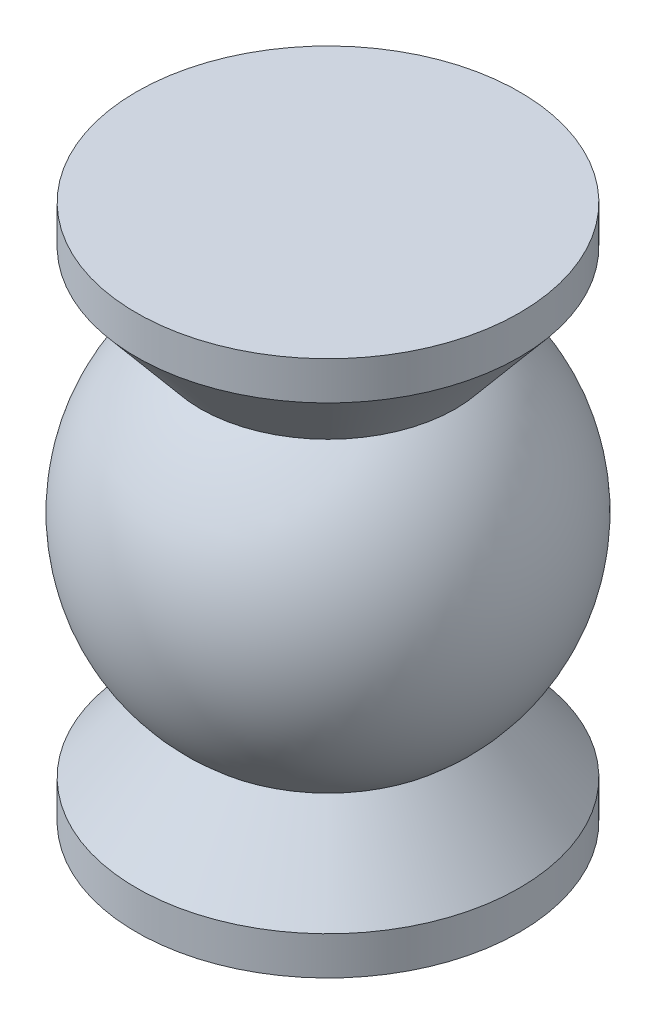
ISO-10303-21;
HEADER;
FILE_DESCRIPTION(('STEP AP214'),'2;1');
FILE_NAME('part.step','',(''),(''),'','','');
FILE_SCHEMA(('AUTOMOTIVE_DESIGN { 1 0 10303 214 1 1 1 1 }'));
ENDSEC;
DATA;
#1=APPLICATION_CONTEXT('core data for automotive mechanical design processes');
#2=APPLICATION_PROTOCOL_DEFINITION('international standard','automotive_design',2000,#1);
#3=PRODUCT_CONTEXT('',#1,'mechanical');
#4=PRODUCT('Part','Part','',(#3));
#5=PRODUCT_RELATED_PRODUCT_CATEGORY('part','',(#4));
#6=PRODUCT_DEFINITION_FORMATION('','',#4);
#7=PRODUCT_DEFINITION_CONTEXT('part definition',#1,'design');
#8=PRODUCT_DEFINITION('design','',#6,#7);
#9=PRODUCT_DEFINITION_SHAPE('','',#8);
#10=(LENGTH_UNIT() NAMED_UNIT(*) SI_UNIT(.MILLI.,.METRE.));
#11=(NAMED_UNIT(*) PLANE_ANGLE_UNIT() SI_UNIT($,.RADIAN.));
#12=(NAMED_UNIT(*) SI_UNIT($,.STERADIAN.) SOLID_ANGLE_UNIT());
#13=UNCERTAINTY_MEASURE_WITH_UNIT(LENGTH_MEASURE(1.E-05),#10,'distance_accuracy_value','');
#14=(GEOMETRIC_REPRESENTATION_CONTEXT(3) GLOBAL_UNCERTAINTY_ASSIGNED_CONTEXT((#13)) GLOBAL_UNIT_ASSIGNED_CONTEXT((#10,
#11,#12)) REPRESENTATION_CONTEXT('',''));
#15=CARTESIAN_POINT('',(0.,0.,0.));
#16=DIRECTION('',(0.,0.,1.));
#17=DIRECTION('',(1.,0.,0.));
#18=AXIS2_PLACEMENT_3D('',#15,#16,#17);
#19=CARTESIAN_POINT('',(0.,0.,0.));
#20=DIRECTION('',(0.,1.,0.));
#21=DIRECTION('',(-1.,0.,0.));
#22=AXIS2_PLACEMENT_3D('',#19,#20,#21);
#23=PLANE('',#22);
#24=CARTESIAN_POINT('',(0.,0.,0.));
#25=DIRECTION('',(0.,1.,0.));
#26=DIRECTION('',(-1.,0.,0.));
#27=AXIS2_PLACEMENT_3D('',#24,#25,#26);
#28=CIRCLE('',#27,25.);
#29=CARTESIAN_POINT('',(-25.,0.,0.));
#30=VERTEX_POINT('',#29);
#31=EDGE_CURVE('E10',#30,#30,#28,.T.);
#32=ORIENTED_EDGE('',*,*,#31,.T.);
#33=EDGE_LOOP('',(#32));
#34=FACE_BOUND('',#33,.T.);
#35=ADVANCED_FACE('F37',(#34),#23,.T.);
#36=CARTESIAN_POINT('',(0.,0.,0.));
#37=DIRECTION('',(0.,1.,0.));
#38=DIRECTION('',(-1.,0.,0.));
#39=AXIS2_PLACEMENT_3D('',#36,#37,#38);
#40=CYLINDRICAL_SURFACE('',#39,25.);
#41=CARTESIAN_POINT('',(0.,-5.,0.));
#42=DIRECTION('',(0.,1.,0.));
#43=DIRECTION('',(-1.,0.,0.));
#44=AXIS2_PLACEMENT_3D('',#41,#42,#43);
#45=CIRCLE('',#44,25.);
#46=CARTESIAN_POINT('',(-25.,-5.,0.));
#47=VERTEX_POINT('',#46);
#48=EDGE_CURVE('E43',#47,#47,#45,.T.);
#49=ORIENTED_EDGE('',*,*,#48,.T.);
#50=EDGE_LOOP('',(#49));
#51=FACE_BOUND('',#50,.T.);
#52=ORIENTED_EDGE('',*,*,#31,.F.);
#53=EDGE_LOOP('',(#52));
#54=FACE_BOUND('',#53,.T.);
#55=ADVANCED_FACE('F75',(#51,#54),#40,.T.);
#56=CARTESIAN_POINT('',(0.,-5.,0.));
#57=DIRECTION('',(0.,1.,0.));
#58=DIRECTION('',(-1.,0.,0.));
#59=AXIS2_PLACEMENT_3D('',#56,#57,#58);
#60=CONICAL_SURFACE('',#59,25.,0.694738276196703);
#61=CARTESIAN_POINT('',(0.,-15.,0.));
#62=DIRECTION('',(0.,1.,0.));
#63=DIRECTION('',(-1.,0.,0.));
#64=AXIS2_PLACEMENT_3D('',#61,#62,#63);
#65=CIRCLE('',#64,16.6666666666667);
#66=CARTESIAN_POINT('',(-16.6666666666667,-15.,0.));
#67=VERTEX_POINT('',#66);
#68=EDGE_CURVE('E47',#67,#67,#65,.T.);
#69=ORIENTED_EDGE('',*,*,#68,.T.);
#70=EDGE_LOOP('',(#69));
#71=FACE_BOUND('',#70,.T.);
#72=ORIENTED_EDGE('',*,*,#48,.F.);
#73=EDGE_LOOP('',(#72));
#74=FACE_BOUND('',#73,.T.);
#75=ADVANCED_FACE('F79',(#71,#74),#60,.T.);
#76=CARTESIAN_POINT('',(0.,-35.,0.));
#77=DIRECTION('',(0.,1.,0.));
#78=DIRECTION('',(-1.,0.,0.));
#79=AXIS2_PLACEMENT_3D('',#76,#77,#78);
#80=SPHERICAL_SURFACE('',#79,26.0341655863555);
#81=CARTESIAN_POINT('',(0.,-55.,0.));
#82=DIRECTION('',(0.,1.,0.));
#83=DIRECTION('',(-1.,0.,0.));
#84=AXIS2_PLACEMENT_3D('',#81,#82,#83);
#85=CIRCLE('',#84,16.6666666666667);
#86=CARTESIAN_POINT('',(-16.6666666666667,-55.,0.));
#87=VERTEX_POINT('',#86);
#88=EDGE_CURVE('E51',#87,#87,#85,.T.);
#89=CARTESIAN_POINT('',(-16.6666666666667,-55.,0.));
#90=CARTESIAN_POINT('',(-17.0317003772507,-54.6958234441406,0.));
#91=CARTESIAN_POINT('',(-17.3883878154096,-54.3816334350001,0.));
#92=CARTESIAN_POINT('',(-18.0840429657462,-53.7342132116011,0.));
#93=CARTESIAN_POINT('',(-18.423010677924,-53.4009829973424,0.));
#94=CARTESIAN_POINT('',(-19.0821991951676,-52.7164690651504,0.));
#95=CARTESIAN_POINT('',(-19.4024200002334,-52.3651853472172,0.));
#96=CARTESIAN_POINT('',(-20.0231579412727,-51.6456205104708,0.));
#97=CARTESIAN_POINT('',(-20.3236750772461,-51.2773393916577,0.));
#98=CARTESIAN_POINT('',(-20.9041041610628,-50.5248827034786,0.));
#99=CARTESIAN_POINT('',(-21.1840161089061,-50.1407071341126,0.));
#100=CARTESIAN_POINT('',(-21.7223960772385,-49.3576132320333,0.));
#101=CARTESIAN_POINT('',(-21.9808640977276,-48.9586948993199,0.));
#102=CARTESIAN_POINT('',(-22.4755814703313,-48.1473110507519,0.));
#103=CARTESIAN_POINT('',(-22.7118308224459,-47.7348455348973,0.));
#104=CARTESIAN_POINT('',(-23.1614027846714,-46.8976035828406,0.));
#105=CARTESIAN_POINT('',(-23.3747253947823,-46.4728271466385,0.));
#106=CARTESIAN_POINT('',(-23.777804495996,-45.6122364939845,0.));
#107=CARTESIAN_POINT('',(-23.9675609870989,-45.1764222775327,0.));
#108=CARTESIAN_POINT('',(-24.3229391111879,-44.2950622926914,0.));
#109=CARTESIAN_POINT('',(-24.4885607441739,-43.849516524302,0.));
#110=CARTESIAN_POINT('',(-24.7951727487687,-42.9500288298947,0.));
#111=CARTESIAN_POINT('',(-24.9361631203775,-42.496086903877,0.));
#112=CARTESIAN_POINT('',(-25.1930900244201,-41.5811674539838,0.));
#113=CARTESIAN_POINT('',(-25.3090265568541,-41.1201899301083,0.));
#114=CARTESIAN_POINT('',(-25.515498296288,-40.1925809313321,0.));
#115=CARTESIAN_POINT('',(-25.606033503288,-39.7259494564313,0.));
#116=CARTESIAN_POINT('',(-25.7614312387512,-38.7884311485494,0.));
#117=CARTESIAN_POINT('',(-25.8262937672145,-38.3175443155683,0.));
#118=CARTESIAN_POINT('',(-25.9301517389261,-37.3729266386686,0.));
#119=CARTESIAN_POINT('',(-25.9691471821743,-36.8991957947501,0.));
#120=CARTESIAN_POINT('',(-26.0211541058891,-35.950309967221,0.));
#121=CARTESIAN_POINT('',(-26.0341655863555,-35.4751549836105,0.));
#122=CARTESIAN_POINT('',(-26.0341655863555,-34.5248450163895,0.));
#123=CARTESIAN_POINT('',(-26.0211541058891,-34.049690032779,0.));
#124=CARTESIAN_POINT('',(-25.9691471821743,-33.1008042052499,0.));
#125=CARTESIAN_POINT('',(-25.9301517389261,-32.6270733613314,0.));
#126=CARTESIAN_POINT('',(-25.8262937672145,-31.6824556844317,0.));
#127=CARTESIAN_POINT('',(-25.7614312387512,-31.2115688514506,0.));
#128=CARTESIAN_POINT('',(-25.606033503288,-30.2740505435687,0.));
#129=CARTESIAN_POINT('',(-25.515498296288,-29.8074190686679,0.));
#130=CARTESIAN_POINT('',(-25.3090265568541,-28.8798100698917,0.));
#131=CARTESIAN_POINT('',(-25.1930900244201,-28.4188325460162,0.));
#132=CARTESIAN_POINT('',(-24.9361631203775,-27.503913096123,0.));
#133=CARTESIAN_POINT('',(-24.7951727487687,-27.0499711701052,0.));
#134=CARTESIAN_POINT('',(-24.4885607441739,-26.150483475698,0.));
#135=CARTESIAN_POINT('',(-24.3229391111879,-25.7049377073086,0.));
#136=CARTESIAN_POINT('',(-23.9675609870989,-24.8235777224673,0.));
#137=CARTESIAN_POINT('',(-23.777804495996,-24.3877635060154,0.));
#138=CARTESIAN_POINT('',(-23.3747253947823,-23.5271728533615,0.));
#139=CARTESIAN_POINT('',(-23.1614027846714,-23.1023964171594,0.));
#140=CARTESIAN_POINT('',(-22.7118308224459,-22.2651544651027,0.));
#141=CARTESIAN_POINT('',(-22.4755814703313,-21.8526889492481,0.));
#142=CARTESIAN_POINT('',(-21.9808640977276,-21.0413051006801,0.));
#143=CARTESIAN_POINT('',(-21.7223960772385,-20.6423867679667,0.));
#144=CARTESIAN_POINT('',(-21.1840161089061,-19.8592928658874,0.));
#145=CARTESIAN_POINT('',(-20.9041041610628,-19.4751172965214,0.));
#146=CARTESIAN_POINT('',(-20.3236750772461,-18.7226606083423,0.));
#147=CARTESIAN_POINT('',(-20.0231579412726,-18.3543794895292,0.));
#148=CARTESIAN_POINT('',(-19.4024200002334,-17.6348146527828,0.));
#149=CARTESIAN_POINT('',(-19.0821991951676,-17.2835309348496,0.));
#150=CARTESIAN_POINT('',(-18.423010677924,-16.5990170026576,0.));
#151=CARTESIAN_POINT('',(-18.0840429657462,-16.2657867883989,0.));
#152=CARTESIAN_POINT('',(-17.3883878154096,-15.6183665649999,0.));
#153=CARTESIAN_POINT('',(-17.0317003772507,-15.3041765558595,0.));
#154=CARTESIAN_POINT('',(-16.6666666666667,-15.,0.));
#155=B_SPLINE_CURVE_WITH_KNOTS('',3,(#89,#90,#91,#92,#93,#94,#95,#96,#97,#98,#99,#100,#101,#102,
#103,#104,#105,#106,#107,#108,#109,#110,#111,#112,#113,#114,#115,#116,#117,#118,#119,#120,#121,
#122,#123,#124,#125,#126,#127,#128,#129,#130,#131,#132,#133,#134,#135,#136,#137,#138,#139,#140,
#141,#142,#143,#144,#145,#146,#147,#148,#149,#150,#151,#152,#153,#154),.UNSPECIFIED.,.F.,.F.,(4,
2,2,2,2,2,2,2,2,2,2,2,2,2,2,2,2,2,2,2,2,2,2,2,2,2,2,2,2,2,2,2,4),(0.,1.42528696675481,
2.85057393350964,4.27586090026445,5.70114786701928,7.12643483377409,8.55172180052892,
9.97700876728373,11.4022957340386,12.8275827007934,14.2528696675482,15.678156634303,
17.1034436010578,18.5287305678127,19.9540175345675,21.3793045013223,22.8045914680771,
24.2298784348319,25.6551654015867,27.0804523683416,28.5057393350964,29.9310263018512,
31.356313268606,32.7816002353608,34.2068872021157,35.6321741688705,37.0574611356253,
38.4827481023801,39.908035069135,41.3333220358898,42.7586090026446,44.1838959693994,
45.6091829361542),.UNSPECIFIED.);
#156=EDGE_CURVE('BSEAM83',#87,#67,#155,.T.);
#157=ORIENTED_EDGE('',*,*,#88,.T.);
#158=ORIENTED_EDGE('',*,*,#68,.F.);
#159=ORIENTED_EDGE('',*,*,#156,.T.);
#160=ORIENTED_EDGE('',*,*,#156,.F.);
#161=EDGE_LOOP('',(#157,#159,#158,#160));
#162=FACE_BOUND('',#161,.T.);
#163=ADVANCED_FACE('F83',(#162),#80,.T.);
#164=CARTESIAN_POINT('',(0.,-55.,0.));
#165=DIRECTION('',(0.,-1.,0.));
#166=DIRECTION('',(1.,0.,0.));
#167=AXIS2_PLACEMENT_3D('',#164,#165,#166);
#168=CONICAL_SURFACE('',#167,16.6666666666667,0.694738276196701);
#169=CARTESIAN_POINT('',(0.,-65.,0.));
#170=DIRECTION('',(0.,1.,0.));
#171=DIRECTION('',(-1.,0.,0.));
#172=AXIS2_PLACEMENT_3D('',#169,#170,#171);
#173=CIRCLE('',#172,25.);
#174=CARTESIAN_POINT('',(-25.,-65.,0.));
#175=VERTEX_POINT('',#174);
#176=EDGE_CURVE('E56',#175,#175,#173,.T.);
#177=ORIENTED_EDGE('',*,*,#176,.T.);
#178=EDGE_LOOP('',(#177));
#179=FACE_BOUND('',#178,.T.);
#180=ORIENTED_EDGE('',*,*,#88,.F.);
#181=EDGE_LOOP('',(#180));
#182=FACE_BOUND('',#181,.T.);
#183=ADVANCED_FACE('F72',(#179,#182),#168,.T.);
#184=CARTESIAN_POINT('',(0.,0.,0.));
#185=DIRECTION('',(0.,1.,0.));
#186=DIRECTION('',(-1.,0.,0.));
#187=AXIS2_PLACEMENT_3D('',#184,#185,#186);
#188=CYLINDRICAL_SURFACE('',#187,25.);
#189=CARTESIAN_POINT('',(0.,-70.,0.));
#190=DIRECTION('',(0.,1.,0.));
#191=DIRECTION('',(-1.,0.,0.));
#192=AXIS2_PLACEMENT_3D('',#189,#190,#191);
#193=CIRCLE('',#192,25.);
#194=CARTESIAN_POINT('',(-25.,-70.,0.));
#195=VERTEX_POINT('',#194);
#196=EDGE_CURVE('E59',#195,#195,#193,.T.);
#197=ORIENTED_EDGE('',*,*,#196,.T.);
#198=EDGE_LOOP('',(#197));
#199=FACE_BOUND('',#198,.T.);
#200=ORIENTED_EDGE('',*,*,#176,.F.);
#201=EDGE_LOOP('',(#200));
#202=FACE_BOUND('',#201,.T.);
#203=ADVANCED_FACE('F63',(#199,#202),#188,.T.);
#204=CARTESIAN_POINT('',(-25.,-70.,0.));
#205=DIRECTION('',(0.,-1.,0.));
#206=DIRECTION('',(1.,0.,0.));
#207=AXIS2_PLACEMENT_3D('',#204,#205,#206);
#208=PLANE('',#207);
#209=ORIENTED_EDGE('',*,*,#196,.F.);
#210=EDGE_LOOP('',(#209));
#211=FACE_BOUND('',#210,.T.);
#212=ADVANCED_FACE('F66',(#211),#208,.T.);
#213=CLOSED_SHELL('',(#35,#55,#75,#163,#183,#203,#212));
#214=MANIFOLD_SOLID_BREP('B2',#213);
#215=ADVANCED_BREP_SHAPE_REPRESENTATION('',(#18,#214),#14);
#216=SHAPE_DEFINITION_REPRESENTATION(#9,#215);
ENDSEC;
END-ISO-10303-21;
